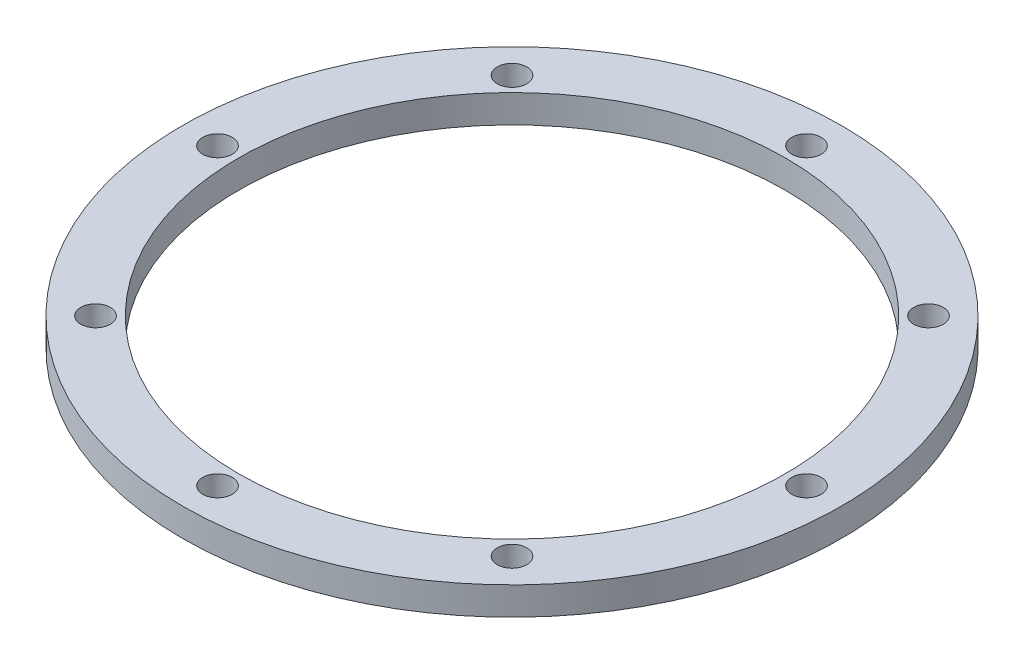
ISO-10303-21;
HEADER;
FILE_DESCRIPTION(('STEP AP214'),'2;1');
FILE_NAME('part.step','',(''),(''),'','','');
FILE_SCHEMA(('AUTOMOTIVE_DESIGN { 1 0 10303 214 1 1 1 1 }'));
ENDSEC;
DATA;
#1=APPLICATION_CONTEXT('core data for automotive mechanical design processes');
#2=APPLICATION_PROTOCOL_DEFINITION('international standard','automotive_design',2000,#1);
#3=PRODUCT_CONTEXT('',#1,'mechanical');
#4=PRODUCT('Part','Part','',(#3));
#5=PRODUCT_RELATED_PRODUCT_CATEGORY('part','',(#4));
#6=PRODUCT_DEFINITION_FORMATION('','',#4);
#7=PRODUCT_DEFINITION_CONTEXT('part definition',#1,'design');
#8=PRODUCT_DEFINITION('design','',#6,#7);
#9=PRODUCT_DEFINITION_SHAPE('','',#8);
#10=(LENGTH_UNIT() NAMED_UNIT(*) SI_UNIT(.MILLI.,.METRE.));
#11=(NAMED_UNIT(*) PLANE_ANGLE_UNIT() SI_UNIT($,.RADIAN.));
#12=(NAMED_UNIT(*) SI_UNIT($,.STERADIAN.) SOLID_ANGLE_UNIT());
#13=UNCERTAINTY_MEASURE_WITH_UNIT(LENGTH_MEASURE(1.E-05),#10,'distance_accuracy_value','');
#14=(GEOMETRIC_REPRESENTATION_CONTEXT(3) GLOBAL_UNCERTAINTY_ASSIGNED_CONTEXT((#13)) GLOBAL_UNIT_ASSIGNED_CONTEXT((#10,
#11,#12)) REPRESENTATION_CONTEXT('',''));
#15=CARTESIAN_POINT('',(0.,0.,0.));
#16=DIRECTION('',(0.,0.,1.));
#17=DIRECTION('',(1.,0.,0.));
#18=AXIS2_PLACEMENT_3D('',#15,#16,#17);
#19=CARTESIAN_POINT('',(0.,0.,0.));
#20=DIRECTION('',(0.,-1.,0.));
#21=DIRECTION('',(0.,0.,-1.));
#22=AXIS2_PLACEMENT_3D('',#19,#20,#21);
#23=CYLINDRICAL_SURFACE('',#22,39.);
#24=CARTESIAN_POINT('',(0.,4.,0.));
#25=DIRECTION('',(0.,-1.,0.));
#26=DIRECTION('',(0.,0.,-1.));
#27=AXIS2_PLACEMENT_3D('',#24,#25,#26);
#28=CIRCLE('',#27,39.);
#29=CARTESIAN_POINT('',(0.,4.,-39.));
#30=VERTEX_POINT('',#29);
#31=EDGE_CURVE('E73',#30,#30,#28,.T.);
#32=ORIENTED_EDGE('',*,*,#31,.F.);
#33=EDGE_LOOP('',(#32));
#34=FACE_BOUND('',#33,.T.);
#35=CARTESIAN_POINT('',(0.,0.,0.));
#36=DIRECTION('',(0.,-1.,0.));
#37=DIRECTION('',(0.,0.,-1.));
#38=AXIS2_PLACEMENT_3D('',#35,#36,#37);
#39=CIRCLE('',#38,39.);
#40=CARTESIAN_POINT('',(0.,0.,-39.));
#41=VERTEX_POINT('',#40);
#42=EDGE_CURVE('E10',#41,#41,#39,.T.);
#43=ORIENTED_EDGE('',*,*,#42,.T.);
#44=EDGE_LOOP('',(#43));
#45=FACE_BOUND('',#44,.T.);
#46=ADVANCED_FACE('F34',(#34,#45),#23,.F.);
#47=CARTESIAN_POINT('',(-39.,0.,0.));
#48=DIRECTION('',(0.,1.,0.));
#49=DIRECTION('',(0.,0.,1.));
#50=AXIS2_PLACEMENT_3D('',#47,#48,#49);
#51=PLANE('',#50);
#52=CARTESIAN_POINT('',(0.,0.,42.));
#53=DIRECTION('',(0.,-1.,0.));
#54=DIRECTION('',(0.,0.,-1.));
#55=AXIS2_PLACEMENT_3D('',#52,#53,#54);
#56=CIRCLE('',#55,2.1);
#57=CARTESIAN_POINT('',(0.,0.,39.9));
#58=VERTEX_POINT('',#57);
#59=EDGE_CURVE('E54',#58,#58,#56,.T.);
#60=ORIENTED_EDGE('',*,*,#59,.F.);
#61=EDGE_LOOP('',(#60));
#62=FACE_BOUND('',#61,.T.);
#63=CARTESIAN_POINT('',(29.698484809835,0.,29.698484809835));
#64=DIRECTION('',(0.,-1.,0.));
#65=DIRECTION('',(0.,0.,-1.));
#66=AXIS2_PLACEMENT_3D('',#63,#64,#65);
#67=CIRCLE('',#66,2.10000000000006);
#68=CARTESIAN_POINT('',(29.698484809835,0.,27.5984848098349));
#69=VERTEX_POINT('',#68);
#70=EDGE_CURVE('E100',#69,#69,#67,.T.);
#71=ORIENTED_EDGE('',*,*,#70,.F.);
#72=EDGE_LOOP('',(#71));
#73=FACE_BOUND('',#72,.T.);
#74=CARTESIAN_POINT('',(42.,0.,0.));
#75=DIRECTION('',(0.,-1.,0.));
#76=DIRECTION('',(0.,0.,-1.));
#77=AXIS2_PLACEMENT_3D('',#74,#75,#76);
#78=CIRCLE('',#77,2.10000000000014);
#79=CARTESIAN_POINT('',(42.,0.,-2.10000000000014));
#80=VERTEX_POINT('',#79);
#81=EDGE_CURVE('E97',#80,#80,#78,.T.);
#82=ORIENTED_EDGE('',*,*,#81,.F.);
#83=EDGE_LOOP('',(#82));
#84=FACE_BOUND('',#83,.T.);
#85=CARTESIAN_POINT('',(29.698484809835,0.,-29.698484809835));
#86=DIRECTION('',(0.,-1.,0.));
#87=DIRECTION('',(0.,0.,-1.));
#88=AXIS2_PLACEMENT_3D('',#85,#86,#87);
#89=CIRCLE('',#88,2.10000000000022);
#90=CARTESIAN_POINT('',(29.698484809835,0.,-31.7984848098352));
#91=VERTEX_POINT('',#90);
#92=EDGE_CURVE('E94',#91,#91,#89,.T.);
#93=ORIENTED_EDGE('',*,*,#92,.F.);
#94=EDGE_LOOP('',(#93));
#95=FACE_BOUND('',#94,.T.);
#96=CARTESIAN_POINT('',(0.,0.,-42.));
#97=DIRECTION('',(0.,-1.,0.));
#98=DIRECTION('',(0.,0.,-1.));
#99=AXIS2_PLACEMENT_3D('',#96,#97,#98);
#100=CIRCLE('',#99,2.10000000000028);
#101=CARTESIAN_POINT('',(0.,0.,-44.1000000000003));
#102=VERTEX_POINT('',#101);
#103=EDGE_CURVE('E91',#102,#102,#100,.T.);
#104=ORIENTED_EDGE('',*,*,#103,.F.);
#105=EDGE_LOOP('',(#104));
#106=FACE_BOUND('',#105,.T.);
#107=CARTESIAN_POINT('',(-29.698484809835,0.,-29.698484809835));
#108=DIRECTION('',(0.,-1.,0.));
#109=DIRECTION('',(0.,0.,-1.));
#110=AXIS2_PLACEMENT_3D('',#107,#108,#109);
#111=CIRCLE('',#110,2.10000000000037);
#112=CARTESIAN_POINT('',(-29.698484809835,0.,-31.7984848098354));
#113=VERTEX_POINT('',#112);
#114=EDGE_CURVE('E88',#113,#113,#111,.T.);
#115=ORIENTED_EDGE('',*,*,#114,.F.);
#116=EDGE_LOOP('',(#115));
#117=FACE_BOUND('',#116,.T.);
#118=CARTESIAN_POINT('',(-42.,0.,0.));
#119=DIRECTION('',(0.,-1.,0.));
#120=DIRECTION('',(0.,0.,-1.));
#121=AXIS2_PLACEMENT_3D('',#118,#119,#120);
#122=CIRCLE('',#121,2.10000000000043);
#123=CARTESIAN_POINT('',(-42.,0.,-2.10000000000043));
#124=VERTEX_POINT('',#123);
#125=EDGE_CURVE('E85',#124,#124,#122,.T.);
#126=ORIENTED_EDGE('',*,*,#125,.F.);
#127=EDGE_LOOP('',(#126));
#128=FACE_BOUND('',#127,.T.);
#129=CARTESIAN_POINT('',(-29.698484809835,0.,29.698484809835));
#130=DIRECTION('',(0.,-1.,0.));
#131=DIRECTION('',(0.,0.,-1.));
#132=AXIS2_PLACEMENT_3D('',#129,#130,#131);
#133=CIRCLE('',#132,2.1000000000005);
#134=CARTESIAN_POINT('',(-29.698484809835,0.,27.5984848098345));
#135=VERTEX_POINT('',#134);
#136=EDGE_CURVE('E82',#135,#135,#133,.T.);
#137=ORIENTED_EDGE('',*,*,#136,.F.);
#138=EDGE_LOOP('',(#137));
#139=FACE_BOUND('',#138,.T.);
#140=ORIENTED_EDGE('',*,*,#42,.F.);
#141=EDGE_LOOP('',(#140));
#142=FACE_BOUND('',#141,.T.);
#143=CARTESIAN_POINT('',(0.,0.,0.));
#144=DIRECTION('',(0.,-1.,0.));
#145=DIRECTION('',(0.,0.,-1.));
#146=AXIS2_PLACEMENT_3D('',#143,#144,#145);
#147=CIRCLE('',#146,47.);
#148=CARTESIAN_POINT('',(0.,0.,-47.));
#149=VERTEX_POINT('',#148);
#150=EDGE_CURVE('E41',#149,#149,#147,.T.);
#151=ORIENTED_EDGE('',*,*,#150,.T.);
#152=EDGE_LOOP('',(#151));
#153=FACE_BOUND('',#152,.T.);
#154=ADVANCED_FACE('F109',(#62,#73,#84,#95,#106,#117,#128,#139,#142,#153),#51,.F.);
#155=CARTESIAN_POINT('',(0.,0.,0.));
#156=DIRECTION('',(0.,-1.,0.));
#157=DIRECTION('',(0.,0.,-1.));
#158=AXIS2_PLACEMENT_3D('',#155,#156,#157);
#159=CYLINDRICAL_SURFACE('',#158,47.);
#160=ORIENTED_EDGE('',*,*,#150,.F.);
#161=EDGE_LOOP('',(#160));
#162=FACE_BOUND('',#161,.T.);
#163=CARTESIAN_POINT('',(0.,4.,0.));
#164=DIRECTION('',(0.,-1.,0.));
#165=DIRECTION('',(0.,0.,-1.));
#166=AXIS2_PLACEMENT_3D('',#163,#164,#165);
#167=CIRCLE('',#166,47.);
#168=CARTESIAN_POINT('',(0.,4.,-47.));
#169=VERTEX_POINT('',#168);
#170=EDGE_CURVE('E46',#169,#169,#167,.T.);
#171=ORIENTED_EDGE('',*,*,#170,.T.);
#172=EDGE_LOOP('',(#171));
#173=FACE_BOUND('',#172,.T.);
#174=ADVANCED_FACE('F112',(#162,#173),#159,.T.);
#175=CARTESIAN_POINT('',(-47.,4.,0.));
#176=DIRECTION('',(0.,-1.,0.));
#177=DIRECTION('',(0.,0.,-1.));
#178=AXIS2_PLACEMENT_3D('',#175,#176,#177);
#179=PLANE('',#178);
#180=CARTESIAN_POINT('',(0.,4.,42.));
#181=DIRECTION('',(0.,-1.,0.));
#182=DIRECTION('',(0.,0.,-1.));
#183=AXIS2_PLACEMENT_3D('',#180,#181,#182);
#184=CIRCLE('',#183,2.1);
#185=CARTESIAN_POINT('',(0.,4.,39.9));
#186=VERTEX_POINT('',#185);
#187=EDGE_CURVE('E37',#186,#186,#184,.T.);
#188=ORIENTED_EDGE('',*,*,#187,.T.);
#189=EDGE_LOOP('',(#188));
#190=FACE_BOUND('',#189,.T.);
#191=CARTESIAN_POINT('',(29.698484809835,4.,29.698484809835));
#192=DIRECTION('',(0.,-1.,0.));
#193=DIRECTION('',(0.,0.,-1.));
#194=AXIS2_PLACEMENT_3D('',#191,#192,#193);
#195=CIRCLE('',#194,2.10000000000006);
#196=CARTESIAN_POINT('',(29.698484809835,4.,27.5984848098349));
#197=VERTEX_POINT('',#196);
#198=EDGE_CURVE('E68',#197,#197,#195,.T.);
#199=ORIENTED_EDGE('',*,*,#198,.T.);
#200=EDGE_LOOP('',(#199));
#201=FACE_BOUND('',#200,.T.);
#202=CARTESIAN_POINT('',(42.,4.,0.));
#203=DIRECTION('',(0.,-1.,0.));
#204=DIRECTION('',(0.,0.,-1.));
#205=AXIS2_PLACEMENT_3D('',#202,#203,#204);
#206=CIRCLE('',#205,2.10000000000014);
#207=CARTESIAN_POINT('',(42.,4.,-2.10000000000014));
#208=VERTEX_POINT('',#207);
#209=EDGE_CURVE('E66',#208,#208,#206,.T.);
#210=ORIENTED_EDGE('',*,*,#209,.T.);
#211=EDGE_LOOP('',(#210));
#212=FACE_BOUND('',#211,.T.);
#213=CARTESIAN_POINT('',(29.698484809835,4.,-29.698484809835));
#214=DIRECTION('',(0.,-1.,0.));
#215=DIRECTION('',(0.,0.,-1.));
#216=AXIS2_PLACEMENT_3D('',#213,#214,#215);
#217=CIRCLE('',#216,2.10000000000022);
#218=CARTESIAN_POINT('',(29.698484809835,4.,-31.7984848098352));
#219=VERTEX_POINT('',#218);
#220=EDGE_CURVE('E63',#219,#219,#217,.T.);
#221=ORIENTED_EDGE('',*,*,#220,.T.);
#222=EDGE_LOOP('',(#221));
#223=FACE_BOUND('',#222,.T.);
#224=CARTESIAN_POINT('',(0.,4.,-42.));
#225=DIRECTION('',(0.,-1.,0.));
#226=DIRECTION('',(0.,0.,-1.));
#227=AXIS2_PLACEMENT_3D('',#224,#225,#226);
#228=CIRCLE('',#227,2.10000000000028);
#229=CARTESIAN_POINT('',(0.,4.,-44.1000000000003));
#230=VERTEX_POINT('',#229);
#231=EDGE_CURVE('E60',#230,#230,#228,.T.);
#232=ORIENTED_EDGE('',*,*,#231,.T.);
#233=EDGE_LOOP('',(#232));
#234=FACE_BOUND('',#233,.T.);
#235=CARTESIAN_POINT('',(-29.698484809835,4.,-29.698484809835));
#236=DIRECTION('',(0.,-1.,0.));
#237=DIRECTION('',(0.,0.,-1.));
#238=AXIS2_PLACEMENT_3D('',#235,#236,#237);
#239=CIRCLE('',#238,2.10000000000037);
#240=CARTESIAN_POINT('',(-29.698484809835,4.,-31.7984848098354));
#241=VERTEX_POINT('',#240);
#242=EDGE_CURVE('E57',#241,#241,#239,.T.);
#243=ORIENTED_EDGE('',*,*,#242,.T.);
#244=EDGE_LOOP('',(#243));
#245=FACE_BOUND('',#244,.T.);
#246=CARTESIAN_POINT('',(-42.,4.,0.));
#247=DIRECTION('',(0.,-1.,0.));
#248=DIRECTION('',(0.,0.,-1.));
#249=AXIS2_PLACEMENT_3D('',#246,#247,#248);
#250=CIRCLE('',#249,2.10000000000043);
#251=CARTESIAN_POINT('',(-42.,4.,-2.10000000000043));
#252=VERTEX_POINT('',#251);
#253=EDGE_CURVE('E53',#252,#252,#250,.T.);
#254=ORIENTED_EDGE('',*,*,#253,.T.);
#255=EDGE_LOOP('',(#254));
#256=FACE_BOUND('',#255,.T.);
#257=CARTESIAN_POINT('',(-29.698484809835,4.,29.698484809835));
#258=DIRECTION('',(0.,-1.,0.));
#259=DIRECTION('',(0.,0.,-1.));
#260=AXIS2_PLACEMENT_3D('',#257,#258,#259);
#261=CIRCLE('',#260,2.1000000000005);
#262=CARTESIAN_POINT('',(-29.698484809835,4.,27.5984848098345));
#263=VERTEX_POINT('',#262);
#264=EDGE_CURVE('E50',#263,#263,#261,.T.);
#265=ORIENTED_EDGE('',*,*,#264,.T.);
#266=EDGE_LOOP('',(#265));
#267=FACE_BOUND('',#266,.T.);
#268=ORIENTED_EDGE('',*,*,#170,.F.);
#269=EDGE_LOOP('',(#268));
#270=FACE_BOUND('',#269,.T.);
#271=ORIENTED_EDGE('',*,*,#31,.T.);
#272=EDGE_LOOP('',(#271));
#273=FACE_BOUND('',#272,.T.);
#274=ADVANCED_FACE('F132',(#190,#201,#212,#223,#234,#245,#256,#267,#270,#273),#179,.F.);
#275=CARTESIAN_POINT('',(-29.698484809835,10.,29.698484809835));
#276=DIRECTION('',(0.,-1.,0.));
#277=DIRECTION('',(0.,0.,-1.));
#278=AXIS2_PLACEMENT_3D('',#275,#276,#277);
#279=CYLINDRICAL_SURFACE('',#278,2.1000000000005);
#280=ORIENTED_EDGE('',*,*,#136,.T.);
#281=EDGE_LOOP('',(#280));
#282=FACE_BOUND('',#281,.T.);
#283=ORIENTED_EDGE('',*,*,#264,.F.);
#284=EDGE_LOOP('',(#283));
#285=FACE_BOUND('',#284,.T.);
#286=ADVANCED_FACE('F137',(#282,#285),#279,.F.);
#287=CARTESIAN_POINT('',(-42.,10.,0.));
#288=DIRECTION('',(0.,-1.,0.));
#289=DIRECTION('',(0.,0.,-1.));
#290=AXIS2_PLACEMENT_3D('',#287,#288,#289);
#291=CYLINDRICAL_SURFACE('',#290,2.10000000000043);
#292=ORIENTED_EDGE('',*,*,#125,.T.);
#293=EDGE_LOOP('',(#292));
#294=FACE_BOUND('',#293,.T.);
#295=ORIENTED_EDGE('',*,*,#253,.F.);
#296=EDGE_LOOP('',(#295));
#297=FACE_BOUND('',#296,.T.);
#298=ADVANCED_FACE('F142',(#294,#297),#291,.F.);
#299=CARTESIAN_POINT('',(-29.698484809835,10.,-29.698484809835));
#300=DIRECTION('',(0.,-1.,0.));
#301=DIRECTION('',(0.,0.,-1.));
#302=AXIS2_PLACEMENT_3D('',#299,#300,#301);
#303=CYLINDRICAL_SURFACE('',#302,2.10000000000037);
#304=ORIENTED_EDGE('',*,*,#114,.T.);
#305=EDGE_LOOP('',(#304));
#306=FACE_BOUND('',#305,.T.);
#307=ORIENTED_EDGE('',*,*,#242,.F.);
#308=EDGE_LOOP('',(#307));
#309=FACE_BOUND('',#308,.T.);
#310=ADVANCED_FACE('F178',(#306,#309),#303,.F.);
#311=CARTESIAN_POINT('',(0.,10.,-42.));
#312=DIRECTION('',(0.,-1.,0.));
#313=DIRECTION('',(0.,0.,-1.));
#314=AXIS2_PLACEMENT_3D('',#311,#312,#313);
#315=CYLINDRICAL_SURFACE('',#314,2.10000000000028);
#316=ORIENTED_EDGE('',*,*,#103,.T.);
#317=EDGE_LOOP('',(#316));
#318=FACE_BOUND('',#317,.T.);
#319=ORIENTED_EDGE('',*,*,#231,.F.);
#320=EDGE_LOOP('',(#319));
#321=FACE_BOUND('',#320,.T.);
#322=ADVANCED_FACE('F187',(#318,#321),#315,.F.);
#323=CARTESIAN_POINT('',(29.698484809835,10.,-29.698484809835));
#324=DIRECTION('',(0.,-1.,0.));
#325=DIRECTION('',(0.,0.,-1.));
#326=AXIS2_PLACEMENT_3D('',#323,#324,#325);
#327=CYLINDRICAL_SURFACE('',#326,2.10000000000022);
#328=ORIENTED_EDGE('',*,*,#92,.T.);
#329=EDGE_LOOP('',(#328));
#330=FACE_BOUND('',#329,.T.);
#331=ORIENTED_EDGE('',*,*,#220,.F.);
#332=EDGE_LOOP('',(#331));
#333=FACE_BOUND('',#332,.T.);
#334=ADVANCED_FACE('F196',(#330,#333),#327,.F.);
#335=CARTESIAN_POINT('',(42.,10.,0.));
#336=DIRECTION('',(0.,-1.,0.));
#337=DIRECTION('',(0.,0.,-1.));
#338=AXIS2_PLACEMENT_3D('',#335,#336,#337);
#339=CYLINDRICAL_SURFACE('',#338,2.10000000000014);
#340=ORIENTED_EDGE('',*,*,#81,.T.);
#341=EDGE_LOOP('',(#340));
#342=FACE_BOUND('',#341,.T.);
#343=ORIENTED_EDGE('',*,*,#209,.F.);
#344=EDGE_LOOP('',(#343));
#345=FACE_BOUND('',#344,.T.);
#346=ADVANCED_FACE('F205',(#342,#345),#339,.F.);
#347=CARTESIAN_POINT('',(29.698484809835,10.,29.698484809835));
#348=DIRECTION('',(0.,-1.,0.));
#349=DIRECTION('',(0.,0.,-1.));
#350=AXIS2_PLACEMENT_3D('',#347,#348,#349);
#351=CYLINDRICAL_SURFACE('',#350,2.10000000000006);
#352=ORIENTED_EDGE('',*,*,#70,.T.);
#353=EDGE_LOOP('',(#352));
#354=FACE_BOUND('',#353,.T.);
#355=ORIENTED_EDGE('',*,*,#198,.F.);
#356=EDGE_LOOP('',(#355));
#357=FACE_BOUND('',#356,.T.);
#358=ADVANCED_FACE('F214',(#354,#357),#351,.F.);
#359=CARTESIAN_POINT('',(0.,10.,42.));
#360=DIRECTION('',(0.,-1.,0.));
#361=DIRECTION('',(0.,0.,-1.));
#362=AXIS2_PLACEMENT_3D('',#359,#360,#361);
#363=CYLINDRICAL_SURFACE('',#362,2.1);
#364=ORIENTED_EDGE('',*,*,#59,.T.);
#365=EDGE_LOOP('',(#364));
#366=FACE_BOUND('',#365,.T.);
#367=ORIENTED_EDGE('',*,*,#187,.F.);
#368=EDGE_LOOP('',(#367));
#369=FACE_BOUND('',#368,.T.);
#370=ADVANCED_FACE('F106',(#366,#369),#363,.F.);
#371=CLOSED_SHELL('',(#46,#154,#174,#274,#286,#298,#310,#322,#334,#346,#358,#370));
#372=MANIFOLD_SOLID_BREP('B2',#371);
#373=ADVANCED_BREP_SHAPE_REPRESENTATION('',(#18,#372),#14);
#374=SHAPE_DEFINITION_REPRESENTATION(#9,#373);
ENDSEC;
END-ISO-10303-21;
